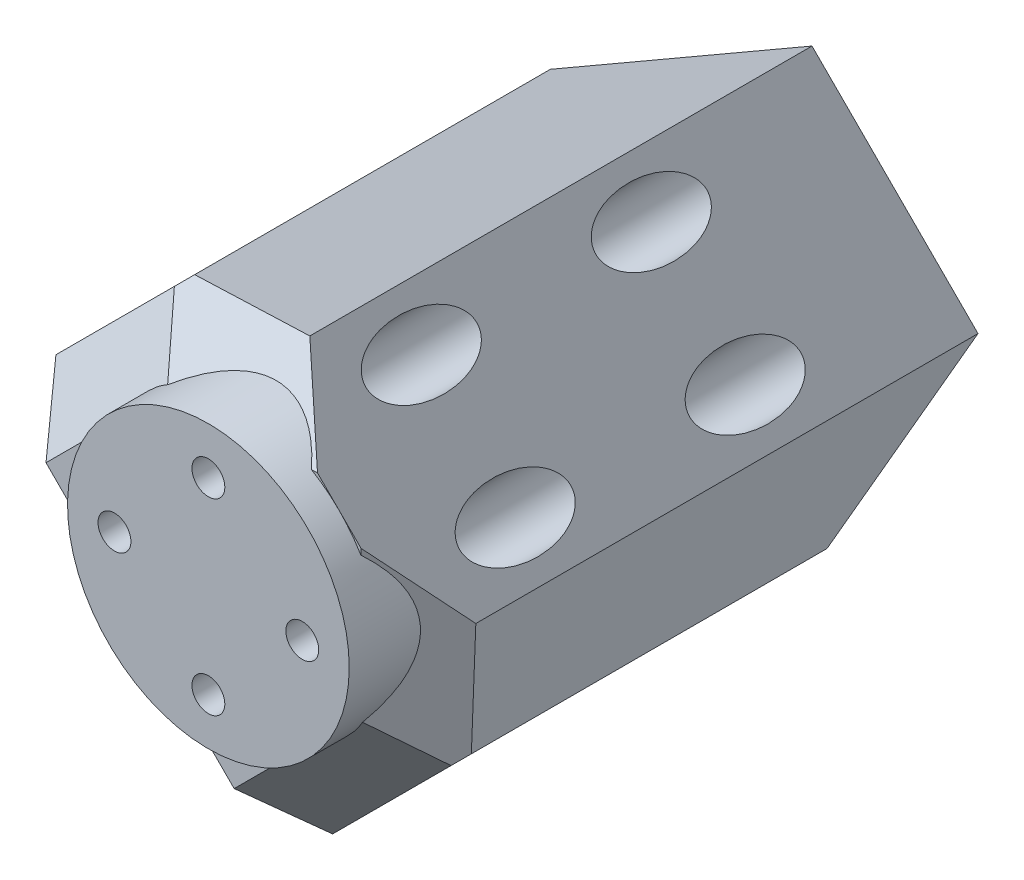
ISO-10303-21;
HEADER;
FILE_DESCRIPTION(('STEP AP214'),'2;1');
FILE_NAME('part.step','',(''),(''),'','','');
FILE_SCHEMA(('AUTOMOTIVE_DESIGN { 1 0 10303 214 1 1 1 1 }'));
ENDSEC;
DATA;
#1=APPLICATION_CONTEXT('core data for automotive mechanical design processes');
#2=APPLICATION_PROTOCOL_DEFINITION('international standard','automotive_design',2000,#1);
#3=PRODUCT_CONTEXT('',#1,'mechanical');
#4=PRODUCT('Part','Part','',(#3));
#5=PRODUCT_RELATED_PRODUCT_CATEGORY('part','',(#4));
#6=PRODUCT_DEFINITION_FORMATION('','',#4);
#7=PRODUCT_DEFINITION_CONTEXT('part definition',#1,'design');
#8=PRODUCT_DEFINITION('design','',#6,#7);
#9=PRODUCT_DEFINITION_SHAPE('','',#8);
#10=(LENGTH_UNIT() NAMED_UNIT(*) SI_UNIT(.MILLI.,.METRE.));
#11=(NAMED_UNIT(*) PLANE_ANGLE_UNIT() SI_UNIT($,.RADIAN.));
#12=(NAMED_UNIT(*) SI_UNIT($,.STERADIAN.) SOLID_ANGLE_UNIT());
#13=UNCERTAINTY_MEASURE_WITH_UNIT(LENGTH_MEASURE(1.E-05),#10,'distance_accuracy_value','');
#14=(GEOMETRIC_REPRESENTATION_CONTEXT(3) GLOBAL_UNCERTAINTY_ASSIGNED_CONTEXT((#13)) GLOBAL_UNIT_ASSIGNED_CONTEXT((#10,
#11,#12)) REPRESENTATION_CONTEXT('',''));
#15=CARTESIAN_POINT('',(0.,0.,0.));
#16=DIRECTION('',(0.,0.,1.));
#17=DIRECTION('',(1.,0.,0.));
#18=AXIS2_PLACEMENT_3D('',#15,#16,#17);
#19=CARTESIAN_POINT('',(0.,6.,2.));
#20=DIRECTION('',(0.,0.,-1.));
#21=DIRECTION('',(-1.,0.,0.));
#22=AXIS2_PLACEMENT_3D('',#19,#20,#21);
#23=CYLINDRICAL_SURFACE('',#22,1.05);
#24=CARTESIAN_POINT('',(0.,6.,2.));
#25=DIRECTION('',(0.,0.,1.));
#26=DIRECTION('',(1.,0.,0.));
#27=AXIS2_PLACEMENT_3D('',#24,#25,#26);
#28=CIRCLE('',#27,1.05);
#29=CARTESIAN_POINT('',(1.05,6.,2.));
#30=VERTEX_POINT('',#29);
#31=EDGE_CURVE('E414',#30,#30,#28,.T.);
#32=ORIENTED_EDGE('',*,*,#31,.T.);
#33=EDGE_LOOP('',(#32));
#34=FACE_BOUND('',#33,.T.);
#35=CARTESIAN_POINT('',(0.,6.,0.));
#36=DIRECTION('',(0.,0.,-1.));
#37=DIRECTION('',(-1.,0.,0.));
#38=AXIS2_PLACEMENT_3D('',#35,#36,#37);
#39=CIRCLE('',#38,1.05);
#40=CARTESIAN_POINT('',(-1.05,6.,0.));
#41=VERTEX_POINT('',#40);
#42=EDGE_CURVE('E191',#41,#41,#39,.T.);
#43=ORIENTED_EDGE('',*,*,#42,.T.);
#44=EDGE_LOOP('',(#43));
#45=FACE_BOUND('',#44,.T.);
#46=ADVANCED_FACE('F55',(#34,#45),#23,.F.);
#47=CARTESIAN_POINT('',(-6.,0.,2.));
#48=DIRECTION('',(0.,0.,-1.));
#49=DIRECTION('',(-1.,0.,0.));
#50=AXIS2_PLACEMENT_3D('',#47,#48,#49);
#51=CYLINDRICAL_SURFACE('',#50,1.05);
#52=CARTESIAN_POINT('',(-6.,0.,2.));
#53=DIRECTION('',(0.,0.,1.));
#54=DIRECTION('',(1.,0.,0.));
#55=AXIS2_PLACEMENT_3D('',#52,#53,#54);
#56=CIRCLE('',#55,1.05);
#57=CARTESIAN_POINT('',(-4.95,0.,2.));
#58=VERTEX_POINT('',#57);
#59=EDGE_CURVE('E408',#58,#58,#56,.T.);
#60=ORIENTED_EDGE('',*,*,#59,.T.);
#61=EDGE_LOOP('',(#60));
#62=FACE_BOUND('',#61,.T.);
#63=CARTESIAN_POINT('',(-6.,0.,0.));
#64=DIRECTION('',(0.,0.,-1.));
#65=DIRECTION('',(-1.,0.,0.));
#66=AXIS2_PLACEMENT_3D('',#63,#64,#65);
#67=CIRCLE('',#66,1.05);
#68=CARTESIAN_POINT('',(-7.05,0.,0.));
#69=VERTEX_POINT('',#68);
#70=EDGE_CURVE('E456',#69,#69,#67,.T.);
#71=ORIENTED_EDGE('',*,*,#70,.T.);
#72=EDGE_LOOP('',(#71));
#73=FACE_BOUND('',#72,.T.);
#74=ADVANCED_FACE('F523',(#62,#73),#51,.F.);
#75=CARTESIAN_POINT('',(0.,-6.,2.));
#76=DIRECTION('',(0.,0.,-1.));
#77=DIRECTION('',(-1.,0.,0.));
#78=AXIS2_PLACEMENT_3D('',#75,#76,#77);
#79=CYLINDRICAL_SURFACE('',#78,1.05);
#80=CARTESIAN_POINT('',(0.,-6.,2.));
#81=DIRECTION('',(0.,0.,1.));
#82=DIRECTION('',(1.,0.,0.));
#83=AXIS2_PLACEMENT_3D('',#80,#81,#82);
#84=CIRCLE('',#83,1.05);
#85=CARTESIAN_POINT('',(1.05,-6.,2.));
#86=VERTEX_POINT('',#85);
#87=EDGE_CURVE('E403',#86,#86,#84,.T.);
#88=ORIENTED_EDGE('',*,*,#87,.T.);
#89=EDGE_LOOP('',(#88));
#90=FACE_BOUND('',#89,.T.);
#91=CARTESIAN_POINT('',(0.,-6.,0.));
#92=DIRECTION('',(0.,0.,-1.));
#93=DIRECTION('',(-1.,0.,0.));
#94=AXIS2_PLACEMENT_3D('',#91,#92,#93);
#95=CIRCLE('',#94,1.05);
#96=CARTESIAN_POINT('',(-1.05,-6.,0.));
#97=VERTEX_POINT('',#96);
#98=EDGE_CURVE('E452',#97,#97,#95,.T.);
#99=ORIENTED_EDGE('',*,*,#98,.T.);
#100=EDGE_LOOP('',(#99));
#101=FACE_BOUND('',#100,.T.);
#102=ADVANCED_FACE('F529',(#90,#101),#79,.F.);
#103=CARTESIAN_POINT('',(6.,0.,2.));
#104=DIRECTION('',(0.,0.,-1.));
#105=DIRECTION('',(-1.,0.,0.));
#106=AXIS2_PLACEMENT_3D('',#103,#104,#105);
#107=CYLINDRICAL_SURFACE('',#106,1.05);
#108=CARTESIAN_POINT('',(6.,0.,2.));
#109=DIRECTION('',(0.,0.,1.));
#110=DIRECTION('',(1.,0.,0.));
#111=AXIS2_PLACEMENT_3D('',#108,#109,#110);
#112=CIRCLE('',#111,1.05);
#113=CARTESIAN_POINT('',(7.05,0.,2.));
#114=VERTEX_POINT('',#113);
#115=EDGE_CURVE('E400',#114,#114,#112,.T.);
#116=ORIENTED_EDGE('',*,*,#115,.T.);
#117=EDGE_LOOP('',(#116));
#118=FACE_BOUND('',#117,.T.);
#119=CARTESIAN_POINT('',(6.,0.,0.));
#120=DIRECTION('',(0.,0.,-1.));
#121=DIRECTION('',(-1.,0.,0.));
#122=AXIS2_PLACEMENT_3D('',#119,#120,#121);
#123=CIRCLE('',#122,1.05);
#124=CARTESIAN_POINT('',(4.95,0.,0.));
#125=VERTEX_POINT('',#124);
#126=EDGE_CURVE('E448',#125,#125,#123,.T.);
#127=ORIENTED_EDGE('',*,*,#126,.T.);
#128=EDGE_LOOP('',(#127));
#129=FACE_BOUND('',#128,.T.);
#130=ADVANCED_FACE('F520',(#118,#129),#107,.F.);
#131=CARTESIAN_POINT('',(0.,0.,0.));
#132=DIRECTION('',(0.,0.,-1.));
#133=DIRECTION('',(-1.,0.,0.));
#134=AXIS2_PLACEMENT_3D('',#131,#132,#133);
#135=PLANE('',#134);
#136=DIRECTION('',(-0.707106781186546,0.707106781186549,0.));
#137=VECTOR('',#136,1.);
#138=CARTESIAN_POINT('',(15.2027957955108,-2.47487373415295,0.));
#139=LINE('',#138,#137);
#140=CARTESIAN_POINT('',(6.36396103067894,6.36396103067891,0.));
#141=VERTEX_POINT('',#140);
#142=CARTESIAN_POINT('',(4.97165205518751,7.75627000617035,0.));
#143=VERTEX_POINT('',#142);
#144=EDGE_CURVE('E323',#141,#143,#139,.T.);
#145=ORIENTED_EDGE('',*,*,#144,.T.);
#146=DIRECTION('',(-0.999247156877888,-0.0387958692576702,0.));
#147=VECTOR('',#146,1.);
#148=CARTESIAN_POINT('',(-0.253175639005564,7.55341555647534,0.));
#149=LINE('',#148,#147);
#150=CARTESIAN_POINT('',(4.59018564589768,7.74145953526819,0.));
#151=VERTEX_POINT('',#150);
#152=EDGE_CURVE('E368',#143,#151,#149,.T.);
#153=ORIENTED_EDGE('',*,*,#152,.T.);
#154=CARTESIAN_POINT('',(0.,0.,0.));
#155=DIRECTION('',(0.,0.,1.));
#156=DIRECTION('',(1.,0.,0.));
#157=AXIS2_PLACEMENT_3D('',#154,#155,#156);
#158=CIRCLE('',#157,9.);
#159=EDGE_CURVE('E286',#141,#151,#158,.T.);
#160=ORIENTED_EDGE('',*,*,#159,.F.);
#161=EDGE_LOOP('',(#145,#153,#160));
#162=FACE_BOUND('',#161,.T.);
#163=ADVANCED_FACE('F239',(#162),#135,.F.);
#164=DIRECTION('',(-0.707106781186546,0.707106781186549,0.));
#165=VECTOR('',#164,1.);
#166=CARTESIAN_POINT('',(2.47487373415289,-15.2027957955108,0.));
#167=LINE('',#166,#165);
#168=CARTESIAN_POINT('',(-0.353553390593316,-12.3743686707646,0.));
#169=VERTEX_POINT('',#168);
#170=CARTESIAN_POINT('',(-6.36396103067894,-6.36396103067892,0.));
#171=VERTEX_POINT('',#170);
#172=EDGE_CURVE('E265',#169,#171,#167,.T.);
#173=ORIENTED_EDGE('',*,*,#172,.F.);
#174=DIRECTION('',(0.707106781186549,0.707106781186546,0.));
#175=VECTOR('',#174,1.);
#176=CARTESIAN_POINT('',(12.3743686707646,0.353553390593268,0.));
#177=LINE('',#176,#175);
#178=CARTESIAN_POINT('',(3.91875757375038,-8.10205770642088,0.));
#179=VERTEX_POINT('',#178);
#180=EDGE_CURVE('E274',#169,#179,#177,.T.);
#181=ORIENTED_EDGE('',*,*,#180,.T.);
#182=EDGE_CURVE('E287',#171,#179,#158,.T.);
#183=ORIENTED_EDGE('',*,*,#182,.F.);
#184=EDGE_LOOP('',(#173,#181,#183));
#185=FACE_BOUND('',#184,.T.);
#186=ADVANCED_FACE('F513',(#185),#135,.F.);
#187=CARTESIAN_POINT('',(0.,0.,2.));
#188=DIRECTION('',(0.,0.,-1.));
#189=DIRECTION('',(-1.,0.,0.));
#190=AXIS2_PLACEMENT_3D('',#187,#188,#189);
#191=CYLINDRICAL_SURFACE('',#190,9.);
#192=CARTESIAN_POINT('',(0.,0.,2.));
#193=DIRECTION('',(0.,0.,1.));
#194=DIRECTION('',(1.,0.,0.));
#195=AXIS2_PLACEMENT_3D('',#192,#193,#194);
#196=CIRCLE('',#195,9.);
#197=CARTESIAN_POINT('',(9.,0.,2.));
#198=VERTEX_POINT('',#197);
#199=EDGE_CURVE('E417',#198,#198,#196,.T.);
#200=ORIENTED_EDGE('',*,*,#199,.F.);
#201=EDGE_LOOP('',(#200));
#202=FACE_BOUND('',#201,.T.);
#203=ORIENTED_EDGE('',*,*,#159,.T.);
#204=CARTESIAN_POINT('',(0.,0.,13.3904937324361));
#205=DIRECTION('',(0.0337861125026571,-0.870213182646032,-0.491515529104648));
#206=DIRECTION('',(-0.0190687722052585,0.49114549501915,-0.870868810240083));
#207=AXIS2_PLACEMENT_3D('',#204,#205,#206);
#208=ELLIPSE('',#207,18.3107134303458,9.);
#209=CARTESIAN_POINT('',(-4.90677790253837,7.54476842687442,-0.304572845786324));
#210=VERTEX_POINT('',#209);
#211=EDGE_CURVE('E318',#151,#210,#208,.F.);
#212=ORIENTED_EDGE('',*,*,#211,.T.);
#213=CARTESIAN_POINT('',(0.,0.,8.49999999999984));
#214=DIRECTION('',(0.499999999999997,-0.499999999999999,-0.707106781186551));
#215=DIRECTION('',(-0.500000000000001,0.500000000000003,-0.707106781186544));
#216=AXIS2_PLACEMENT_3D('',#213,#214,#215);
#217=ELLIPSE('',#216,12.7279220613578,9.);
#218=CARTESIAN_POINT('',(-8.10205770642093,3.91875757375028,0.));
#219=VERTEX_POINT('',#218);
#220=EDGE_CURVE('E344',#210,#219,#217,.F.);
#221=ORIENTED_EDGE('',*,*,#220,.T.);
#222=EDGE_CURVE('E282',#219,#171,#158,.T.);
#223=ORIENTED_EDGE('',*,*,#222,.T.);
#224=ORIENTED_EDGE('',*,*,#182,.T.);
#225=CARTESIAN_POINT('',(0.,0.,8.50000000000006));
#226=DIRECTION('',(0.500000000000002,-0.500000000000003,0.707106781186544));
#227=DIRECTION('',(0.499999999999997,-0.499999999999998,-0.707106781186551));
#228=AXIS2_PLACEMENT_3D('',#225,#226,#227);
#229=ELLIPSE('',#228,12.7279220613579,9.);
#230=CARTESIAN_POINT('',(7.54476842687439,-4.90677790253843,-0.304572845786288));
#231=VERTEX_POINT('',#230);
#232=EDGE_CURVE('E393',#179,#231,#229,.T.);
#233=ORIENTED_EDGE('',*,*,#232,.T.);
#234=CARTESIAN_POINT('',(0.,0.,13.3904937324361));
#235=DIRECTION('',(0.870213182646032,-0.0337861125026576,0.491515529104648));
#236=DIRECTION('',(0.491145495019151,-0.0190687722052588,-0.870868810240083));
#237=AXIS2_PLACEMENT_3D('',#234,#235,#236);
#238=ELLIPSE('',#237,18.3107134303458,9.);
#239=CARTESIAN_POINT('',(7.74145953526819,4.5901856458977,0.));
#240=VERTEX_POINT('',#239);
#241=EDGE_CURVE('E67',#231,#240,#238,.T.);
#242=ORIENTED_EDGE('',*,*,#241,.T.);
#243=EDGE_CURVE('E298',#240,#141,#158,.T.);
#244=ORIENTED_EDGE('',*,*,#243,.T.);
#245=EDGE_LOOP('',(#203,#212,#221,#223,#224,#233,#242,#244));
#246=FACE_BOUND('',#245,.T.);
#247=ADVANCED_FACE('F391',(#202,#246),#191,.T.);
#248=CARTESIAN_POINT('',(0.,0.,2.));
#249=DIRECTION('',(0.,0.,1.));
#250=DIRECTION('',(1.,0.,0.));
#251=AXIS2_PLACEMENT_3D('',#248,#249,#250);
#252=PLANE('',#251);
#253=ORIENTED_EDGE('',*,*,#115,.F.);
#254=EDGE_LOOP('',(#253));
#255=FACE_BOUND('',#254,.T.);
#256=ORIENTED_EDGE('',*,*,#87,.F.);
#257=EDGE_LOOP('',(#256));
#258=FACE_BOUND('',#257,.T.);
#259=ORIENTED_EDGE('',*,*,#59,.F.);
#260=EDGE_LOOP('',(#259));
#261=FACE_BOUND('',#260,.T.);
#262=ORIENTED_EDGE('',*,*,#31,.F.);
#263=EDGE_LOOP('',(#262));
#264=FACE_BOUND('',#263,.T.);
#265=ORIENTED_EDGE('',*,*,#199,.T.);
#266=EDGE_LOOP('',(#265));
#267=FACE_BOUND('',#266,.T.);
#268=ADVANCED_FACE('F233',(#255,#258,#261,#264,#267),#252,.T.);
#269=CARTESIAN_POINT('',(-6.14222664866223,-6.14222664866221,1.65041984364444));
#270=DIRECTION('',(-0.694678991801553,-0.69467899180155,0.186660645823271));
#271=DIRECTION('',(0.707106781186546,-0.707106781186549,0.));
#272=AXIS2_PLACEMENT_3D('',#269,#270,#271);
#273=PLANE('',#272);
#274=DIRECTION('',(-0.707106781186546,0.707106781186549,0.));
#275=VECTOR('',#274,1.);
#276=CARTESIAN_POINT('',(-8.1317279836453,-8.13172798364525,-13.1578947368419));
#277=LINE('',#276,#275);
#278=CARTESIAN_POINT('',(0.70710678118654,-16.9705627484771,-13.1578947368419));
#279=VERTEX_POINT('',#278);
#280=CARTESIAN_POINT('',(-16.9705627484771,0.707106781186595,-13.157894736842));
#281=VERTEX_POINT('',#280);
#282=EDGE_CURVE('E155',#279,#281,#277,.T.);
#283=ORIENTED_EDGE('',*,*,#282,.F.);
#284=DIRECTION('',(0.131989008442295,0.131989008442295,0.982424451701422));
#285=VECTOR('',#284,1.);
#286=CARTESIAN_POINT('',(-4.24264068711933,-21.920310216783,-50.));
#287=LINE('',#286,#285);
#288=CARTESIAN_POINT('',(1.9374725804511,-15.7401969492126,-4.00000000000008));
#289=VERTEX_POINT('',#288);
#290=EDGE_CURVE('E184',#279,#289,#287,.T.);
#291=ORIENTED_EDGE('',*,*,#290,.T.);
#292=DIRECTION('',(-0.401393623541272,0.589701743227307,0.700810254644638));
#293=VECTOR('',#292,1.);
#294=CARTESIAN_POINT('',(-3.22563422704082,-8.15489188635399,5.01448848288394));
#295=LINE('',#294,#293);
#296=EDGE_CURVE('E270',#289,#169,#295,.T.);
#297=ORIENTED_EDGE('',*,*,#296,.T.);
#298=ORIENTED_EDGE('',*,*,#172,.T.);
#299=CARTESIAN_POINT('',(-12.3743686707645,-0.353553390593302,0.));
#300=VERTEX_POINT('',#299);
#301=EDGE_CURVE('E188',#171,#300,#167,.T.);
#302=ORIENTED_EDGE('',*,*,#301,.T.);
#303=DIRECTION('',(0.589701743227309,-0.401393623541281,0.700810254644631));
#304=VECTOR('',#303,1.);
#305=CARTESIAN_POINT('',(-8.15489188635393,-3.22563422704088,5.0144884828839));
#306=LINE('',#305,#304);
#307=CARTESIAN_POINT('',(-15.7401969492125,1.93747258045116,-4.00000000000004));
#308=VERTEX_POINT('',#307);
#309=EDGE_CURVE('E181',#300,#308,#306,.F.);
#310=ORIENTED_EDGE('',*,*,#309,.T.);
#311=DIRECTION('',(0.131989008442294,0.131989008442294,0.982424451701422));
#312=VECTOR('',#311,1.);
#313=CARTESIAN_POINT('',(-21.920310216783,-4.24264068711924,-50.));
#314=LINE('',#313,#312);
#315=EDGE_CURVE('E172',#281,#308,#314,.T.);
#316=ORIENTED_EDGE('',*,*,#315,.F.);
#317=EDGE_LOOP('',(#283,#291,#297,#298,#302,#310,#316));
#318=FACE_BOUND('',#317,.T.);
#319=ADVANCED_FACE('F178',(#318),#273,.T.);
#320=CARTESIAN_POINT('',(-8.83883476483182,8.83883476483186,0.));
#321=DIRECTION('',(0.707106781186546,-0.707106781186549,0.));
#322=DIRECTION('',(0.707106781186549,0.707106781186546,0.));
#323=AXIS2_PLACEMENT_3D('',#320,#321,#322);
#324=PLANE('',#323);
#325=DIRECTION('',(-0.268243277556239,-0.268243277556239,-0.9252519052084));
#326=VECTOR('',#325,1.);
#327=CARTESIAN_POINT('',(-6.66196392389743,11.0157056057662,-1.26220970938142));
#328=LINE('',#327,#326);
#329=CARTESIAN_POINT('',(-7.69247588336472,9.98519364629896,-4.81675602466509));
#330=VERTEX_POINT('',#329);
#331=CARTESIAN_POINT('',(-16.9705627484771,0.707106781186591,-36.819673774708));
#332=VERTEX_POINT('',#331);
#333=EDGE_CURVE('E175',#330,#332,#328,.T.);
#334=ORIENTED_EDGE('',*,*,#333,.T.);
#335=DIRECTION('',(0.,0.,-1.));
#336=VECTOR('',#335,1.);
#337=CARTESIAN_POINT('',(-16.9705627484771,0.707106781186573,-50.));
#338=LINE('',#337,#336);
#339=EDGE_CURVE('E158',#281,#332,#338,.T.);
#340=ORIENTED_EDGE('',*,*,#339,.F.);
#341=ORIENTED_EDGE('',*,*,#315,.T.);
#342=DIRECTION('',(0.707106781186549,0.707106781186546,0.));
#343=VECTOR('',#342,1.);
#344=CARTESIAN_POINT('',(-8.83883476483182,8.83883476483186,-4.00000000000003));
#345=LINE('',#344,#343);
#346=CARTESIAN_POINT('',(-8.17243197749716,9.50523755216652,-4.00000000000003));
#347=VERTEX_POINT('',#346);
#348=EDGE_CURVE('E507',#308,#347,#345,.T.);
#349=ORIENTED_EDGE('',*,*,#348,.T.);
#350=DIRECTION('',(-0.451943650425837,-0.451943650425834,0.769086388957405));
#351=VECTOR('',#350,1.);
#352=CARTESIAN_POINT('',(-8.35239294667875,9.32527658298493,-3.69375489220676));
#353=LINE('',#352,#351);
#354=EDGE_CURVE('E363',#347,#330,#353,.F.);
#355=ORIENTED_EDGE('',*,*,#354,.T.);
#356=EDGE_LOOP('',(#334,#340,#341,#349,#355));
#357=FACE_BOUND('',#356,.T.);
#358=ADVANCED_FACE('F170',(#357),#324,.F.);
#359=CARTESIAN_POINT('',(8.83883476483183,-8.83883476483186,0.));
#360=DIRECTION('',(0.707106781186546,-0.707106781186549,0.));
#361=DIRECTION('',(0.707106781186549,0.707106781186546,0.));
#362=AXIS2_PLACEMENT_3D('',#359,#360,#361);
#363=PLANE('',#362);
#364=DIRECTION('',(0.,0.,1.));
#365=VECTOR('',#364,1.);
#366=CARTESIAN_POINT('',(0.707106781186538,-16.9705627484771,0.));
#367=LINE('',#366,#365);
#368=CARTESIAN_POINT('',(0.707106781186542,-16.9705627484771,-36.8196737747081));
#369=VERTEX_POINT('',#368);
#370=EDGE_CURVE('E161',#369,#279,#367,.T.);
#371=ORIENTED_EDGE('',*,*,#370,.F.);
#372=DIRECTION('',(0.268243277556239,0.268243277556239,0.9252519052084));
#373=VECTOR('',#372,1.);
#374=CARTESIAN_POINT('',(10.7718811919716,-6.90578833769207,-2.10323359432286));
#375=LINE('',#374,#373);
#376=CARTESIAN_POINT('',(9.98519364629894,-7.69247588336476,-4.81675602466509));
#377=VERTEX_POINT('',#376);
#378=EDGE_CURVE('E326',#369,#377,#375,.T.);
#379=ORIENTED_EDGE('',*,*,#378,.T.);
#380=DIRECTION('',(-0.451943650425836,-0.451943650425833,0.769086388957406));
#381=VECTOR('',#380,1.);
#382=CARTESIAN_POINT('',(7.84267309047031,-9.83499643919338,-1.17076299877201));
#383=LINE('',#382,#381);
#384=CARTESIAN_POINT('',(9.50523755216652,-8.17243197749717,-4.00000000000007));
#385=VERTEX_POINT('',#384);
#386=EDGE_CURVE('E83',#377,#385,#383,.T.);
#387=ORIENTED_EDGE('',*,*,#386,.T.);
#388=DIRECTION('',(-0.707106781186549,-0.707106781186546,0.));
#389=VECTOR('',#388,1.);
#390=CARTESIAN_POINT('',(2.47487373415289,-15.2027957955108,-4.00000000000007));
#391=LINE('',#390,#389);
#392=EDGE_CURVE('E271',#385,#289,#391,.T.);
#393=ORIENTED_EDGE('',*,*,#392,.T.);
#394=ORIENTED_EDGE('',*,*,#290,.F.);
#395=EDGE_LOOP('',(#371,#379,#387,#393,#394));
#396=FACE_BOUND('',#395,.T.);
#397=ADVANCED_FACE('F222',(#396),#363,.T.);
#398=CARTESIAN_POINT('',(5.44813032332758,5.44813032332756,-3.15897611505864));
#399=DIRECTION('',(-0.654251896478633,-0.654251896478631,0.379353281135443));
#400=DIRECTION('',(0.707106781186546,-0.707106781186549,0.));
#401=AXIS2_PLACEMENT_3D('',#398,#399,#400);
#402=PLANE('',#401);
#403=CARTESIAN_POINT('',(0.,-6.,-32.2991236271202));
#404=DIRECTION('',(-0.654251896478633,-0.654251896478631,0.379353281135443));
#405=DIRECTION('',(0.268243277556239,0.268243277556238,0.9252519052084));
#406=AXIS2_PLACEMENT_3D('',#403,#404,#405);
#407=ELLIPSE('',#406,5.40393375236966,2.05);
#408=CARTESIAN_POINT('',(1.44956890143242,-4.55043109856758,-27.2991236271202));
#409=VERTEX_POINT('',#408);
#410=EDGE_CURVE('E444',#409,#409,#407,.F.);
#411=ORIENTED_EDGE('',*,*,#410,.F.);
#412=EDGE_LOOP('',(#411));
#413=FACE_BOUND('',#412,.T.);
#414=CARTESIAN_POINT('',(0.,6.,-11.6033153972701));
#415=DIRECTION('',(-0.654251896478633,-0.654251896478631,0.379353281135443));
#416=DIRECTION('',(0.268243277556239,0.268243277556238,0.9252519052084));
#417=AXIS2_PLACEMENT_3D('',#414,#415,#416);
#418=ELLIPSE('',#417,5.40393375236966,2.05);
#419=CARTESIAN_POINT('',(1.44956890143242,7.44956890143242,-6.60331539727006));
#420=VERTEX_POINT('',#419);
#421=EDGE_CURVE('E440',#420,#420,#418,.F.);
#422=ORIENTED_EDGE('',*,*,#421,.F.);
#423=EDGE_LOOP('',(#422));
#424=FACE_BOUND('',#423,.T.);
#425=CARTESIAN_POINT('',(6.,0.,-11.60331539727));
#426=DIRECTION('',(-0.654251896478633,-0.654251896478631,0.379353281135443));
#427=DIRECTION('',(0.268243277556239,0.268243277556238,0.9252519052084));
#428=AXIS2_PLACEMENT_3D('',#425,#426,#427);
#429=ELLIPSE('',#428,5.40393375236966,2.05);
#430=CARTESIAN_POINT('',(7.44956890143243,1.44956890143242,-6.60331539727002));
#431=VERTEX_POINT('',#430);
#432=EDGE_CURVE('E435',#431,#431,#429,.F.);
#433=ORIENTED_EDGE('',*,*,#432,.F.);
#434=EDGE_LOOP('',(#433));
#435=FACE_BOUND('',#434,.T.);
#436=CARTESIAN_POINT('',(-6.,0.,-32.2991236271203));
#437=DIRECTION('',(-0.654251896478633,-0.654251896478631,0.379353281135443));
#438=DIRECTION('',(0.268243277556239,0.268243277556238,0.9252519052084));
#439=AXIS2_PLACEMENT_3D('',#436,#437,#438);
#440=ELLIPSE('',#439,5.40393375236966,2.05);
#441=CARTESIAN_POINT('',(-4.55043109856758,1.44956890143242,-27.2991236271203));
#442=VERTEX_POINT('',#441);
#443=EDGE_CURVE('E431',#442,#442,#440,.F.);
#444=ORIENTED_EDGE('',*,*,#443,.F.);
#445=EDGE_LOOP('',(#444));
#446=FACE_BOUND('',#445,.T.);
#447=DIRECTION('',(0.268243277556239,0.268243277556239,0.9252519052084));
#448=VECTOR('',#447,1.);
#449=CARTESIAN_POINT('',(0.144829464428489,10.7514311822267,-3.15897611505864));
#450=LINE('',#449,#448);
#451=CARTESIAN_POINT('',(-13.4350288425444,-2.82842712474616,-50.));
#452=VERTEX_POINT('',#451);
#453=CARTESIAN_POINT('',(-0.335783776048503,10.2708179417497,-4.81675602466509));
#454=VERTEX_POINT('',#453);
#455=EDGE_CURVE('E343',#452,#454,#450,.T.);
#456=ORIENTED_EDGE('',*,*,#455,.T.);
#457=DIRECTION('',(-0.698752415898631,0.331053733054702,-0.634151785542209));
#458=VECTOR('',#457,1.);
#459=CARTESIAN_POINT('',(2.44834588069542,8.95175772070123,-2.2900230176177));
#460=LINE('',#459,#458);
#461=EDGE_CURVE('E310',#454,#143,#460,.F.);
#462=ORIENTED_EDGE('',*,*,#461,.T.);
#463=ORIENTED_EDGE('',*,*,#144,.F.);
#464=CARTESIAN_POINT('',(7.75627000617034,4.97165205518751,0.));
#465=VERTEX_POINT('',#464);
#466=EDGE_CURVE('E302',#465,#141,#139,.T.);
#467=ORIENTED_EDGE('',*,*,#466,.F.);
#468=DIRECTION('',(0.331053733054701,-0.698752415898633,-0.634151785542208));
#469=VECTOR('',#468,1.);
#470=CARTESIAN_POINT('',(8.95175772070122,2.44834588069541,-2.2900230176177));
#471=LINE('',#470,#469);
#472=CARTESIAN_POINT('',(10.2708179417497,-0.335783776048534,-4.81675602466509));
#473=VERTEX_POINT('',#472);
#474=EDGE_CURVE('E345',#465,#473,#471,.T.);
#475=ORIENTED_EDGE('',*,*,#474,.T.);
#476=DIRECTION('',(-0.268243277556239,-0.268243277556239,-0.9252519052084));
#477=VECTOR('',#476,1.);
#478=CARTESIAN_POINT('',(-2.8284271247462,-13.4350288425444,-50.));
#479=LINE('',#478,#477);
#480=CARTESIAN_POINT('',(-2.8284271247462,-13.4350288425444,-50.));
#481=VERTEX_POINT('',#480);
#482=EDGE_CURVE('E338',#473,#481,#479,.T.);
#483=ORIENTED_EDGE('',*,*,#482,.T.);
#484=DIRECTION('',(-0.707106781186545,0.70710678118655,0.));
#485=VECTOR('',#484,1.);
#486=CARTESIAN_POINT('',(0.707106781186526,-16.9705627484772,-50.));
#487=LINE('',#486,#485);
#488=EDGE_CURVE('E60',#481,#452,#487,.T.);
#489=ORIENTED_EDGE('',*,*,#488,.T.);
#490=EDGE_LOOP('',(#456,#462,#463,#467,#475,#483,#489));
#491=FACE_BOUND('',#490,.T.);
#492=ADVANCED_FACE('F211',(#413,#424,#435,#446,#491),#402,.F.);
#493=ORIENTED_EDGE('',*,*,#243,.F.);
#494=DIRECTION('',(0.0387958692576708,0.999247156877888,0.));
#495=VECTOR('',#494,1.);
#496=CARTESIAN_POINT('',(7.61054041556547,1.21816278245756,0.));
#497=LINE('',#496,#495);
#498=EDGE_CURVE('E305',#240,#465,#497,.T.);
#499=ORIENTED_EDGE('',*,*,#498,.T.);
#500=ORIENTED_EDGE('',*,*,#466,.T.);
#501=EDGE_LOOP('',(#493,#499,#500));
#502=FACE_BOUND('',#501,.T.);
#503=ADVANCED_FACE('F221',(#502),#135,.F.);
#504=ORIENTED_EDGE('',*,*,#222,.F.);
#505=DIRECTION('',(-0.707106781186549,-0.707106781186546,0.));
#506=VECTOR('',#505,1.);
#507=CARTESIAN_POINT('',(-6.01040764008559,6.01040764008562,0.));
#508=LINE('',#507,#506);
#509=EDGE_CURVE('E279',#219,#300,#508,.T.);
#510=ORIENTED_EDGE('',*,*,#509,.T.);
#511=ORIENTED_EDGE('',*,*,#301,.F.);
#512=EDGE_LOOP('',(#504,#510,#511));
#513=FACE_BOUND('',#512,.T.);
#514=ADVANCED_FACE('F237',(#513),#135,.F.);
#515=CARTESIAN_POINT('',(8.83883476483183,-8.83883476483186,-4.00000000000007));
#516=DIRECTION('',(0.500000000000002,-0.500000000000003,0.707106781186544));
#517=DIRECTION('',(0.707106781186549,0.707106781186546,0.));
#518=AXIS2_PLACEMENT_3D('',#515,#516,#517);
#519=PLANE('',#518);
#520=ORIENTED_EDGE('',*,*,#392,.F.);
#521=DIRECTION('',(-0.369412794282357,0.615349857555298,0.69633234897366));
#522=VECTOR('',#521,1.);
#523=CARTESIAN_POINT('',(9.56578177663039,-8.27328360060353,-4.11412409827233));
#524=LINE('',#523,#522);
#525=EDGE_CURVE('E75',#385,#231,#524,.T.);
#526=ORIENTED_EDGE('',*,*,#525,.T.);
#527=ORIENTED_EDGE('',*,*,#232,.F.);
#528=ORIENTED_EDGE('',*,*,#180,.F.);
#529=ORIENTED_EDGE('',*,*,#296,.F.);
#530=EDGE_LOOP('',(#520,#526,#527,#528,#529));
#531=FACE_BOUND('',#530,.T.);
#532=ADVANCED_FACE('F512',(#531),#519,.T.);
#533=CARTESIAN_POINT('',(-6.01040764008559,6.01040764008561,0.));
#534=DIRECTION('',(0.499999999999997,-0.499999999999999,-0.707106781186551));
#535=DIRECTION('',(-0.707106781186549,-0.707106781186546,0.));
#536=AXIS2_PLACEMENT_3D('',#533,#534,#535);
#537=PLANE('',#536);
#538=ORIENTED_EDGE('',*,*,#220,.F.);
#539=DIRECTION('',(-0.615349857555311,0.369412794282352,-0.696332348973651));
#540=VECTOR('',#539,1.);
#541=CARTESIAN_POINT('',(-4.84537950658674,7.50790914636194,-0.235094176454918));
#542=LINE('',#541,#540);
#543=EDGE_CURVE('E361',#210,#347,#542,.T.);
#544=ORIENTED_EDGE('',*,*,#543,.T.);
#545=ORIENTED_EDGE('',*,*,#348,.F.);
#546=ORIENTED_EDGE('',*,*,#309,.F.);
#547=ORIENTED_EDGE('',*,*,#509,.F.);
#548=EDGE_LOOP('',(#538,#544,#545,#546,#547));
#549=FACE_BOUND('',#548,.T.);
#550=ADVANCED_FACE('F504',(#549),#537,.F.);
#551=CARTESIAN_POINT('',(-6.,0.,-53.));
#552=DIRECTION('',(0.,0.,1.));
#553=DIRECTION('',(1.,0.,0.));
#554=AXIS2_PLACEMENT_3D('',#551,#552,#553);
#555=CYLINDRICAL_SURFACE('',#554,2.05);
#556=CARTESIAN_POINT('',(-6.,0.,0.));
#557=DIRECTION('',(0.,0.,-1.));
#558=DIRECTION('',(-1.,0.,0.));
#559=AXIS2_PLACEMENT_3D('',#556,#557,#558);
#560=CIRCLE('',#559,2.05);
#561=CARTESIAN_POINT('',(-8.05,0.,0.));
#562=VERTEX_POINT('',#561);
#563=EDGE_CURVE('E482',#562,#562,#560,.T.);
#564=ORIENTED_EDGE('',*,*,#563,.F.);
#565=EDGE_LOOP('',(#564));
#566=FACE_BOUND('',#565,.T.);
#567=ORIENTED_EDGE('',*,*,#443,.T.);
#568=EDGE_LOOP('',(#567));
#569=FACE_BOUND('',#568,.T.);
#570=ADVANCED_FACE('F549',(#566,#569),#555,.F.);
#571=CARTESIAN_POINT('',(-6.,0.,0.));
#572=DIRECTION('',(0.,0.,-1.));
#573=DIRECTION('',(-1.,0.,0.));
#574=AXIS2_PLACEMENT_3D('',#571,#572,#573);
#575=PLANE('',#574);
#576=ORIENTED_EDGE('',*,*,#70,.F.);
#577=EDGE_LOOP('',(#576));
#578=FACE_BOUND('',#577,.T.);
#579=ORIENTED_EDGE('',*,*,#563,.T.);
#580=EDGE_LOOP('',(#579));
#581=FACE_BOUND('',#580,.T.);
#582=ADVANCED_FACE('F224',(#578,#581),#575,.T.);
#583=CARTESIAN_POINT('',(6.,0.,-53.));
#584=DIRECTION('',(0.,0.,1.));
#585=DIRECTION('',(1.,0.,0.));
#586=AXIS2_PLACEMENT_3D('',#583,#584,#585);
#587=CYLINDRICAL_SURFACE('',#586,2.05);
#588=CARTESIAN_POINT('',(6.,0.,0.));
#589=DIRECTION('',(0.,0.,-1.));
#590=DIRECTION('',(-1.,0.,0.));
#591=AXIS2_PLACEMENT_3D('',#588,#589,#590);
#592=CIRCLE('',#591,2.05);
#593=CARTESIAN_POINT('',(3.95,0.,0.));
#594=VERTEX_POINT('',#593);
#595=EDGE_CURVE('E475',#594,#594,#592,.T.);
#596=ORIENTED_EDGE('',*,*,#595,.F.);
#597=EDGE_LOOP('',(#596));
#598=FACE_BOUND('',#597,.T.);
#599=ORIENTED_EDGE('',*,*,#432,.T.);
#600=EDGE_LOOP('',(#599));
#601=FACE_BOUND('',#600,.T.);
#602=ADVANCED_FACE('F590',(#598,#601),#587,.F.);
#603=CARTESIAN_POINT('',(6.,0.,0.));
#604=DIRECTION('',(0.,0.,-1.));
#605=DIRECTION('',(-1.,0.,0.));
#606=AXIS2_PLACEMENT_3D('',#603,#604,#605);
#607=PLANE('',#606);
#608=ORIENTED_EDGE('',*,*,#126,.F.);
#609=EDGE_LOOP('',(#608));
#610=FACE_BOUND('',#609,.T.);
#611=ORIENTED_EDGE('',*,*,#595,.T.);
#612=EDGE_LOOP('',(#611));
#613=FACE_BOUND('',#612,.T.);
#614=ADVANCED_FACE('F588',(#610,#613),#607,.T.);
#615=CARTESIAN_POINT('',(0.,6.,-53.));
#616=DIRECTION('',(0.,0.,1.));
#617=DIRECTION('',(1.,0.,0.));
#618=AXIS2_PLACEMENT_3D('',#615,#616,#617);
#619=CYLINDRICAL_SURFACE('',#618,2.05);
#620=CARTESIAN_POINT('',(0.,6.,0.));
#621=DIRECTION('',(0.,0.,-1.));
#622=DIRECTION('',(-1.,0.,0.));
#623=AXIS2_PLACEMENT_3D('',#620,#621,#622);
#624=CIRCLE('',#623,2.05);
#625=CARTESIAN_POINT('',(-2.05,6.,0.));
#626=VERTEX_POINT('',#625);
#627=EDGE_CURVE('E472',#626,#626,#624,.T.);
#628=ORIENTED_EDGE('',*,*,#627,.F.);
#629=EDGE_LOOP('',(#628));
#630=FACE_BOUND('',#629,.T.);
#631=ORIENTED_EDGE('',*,*,#421,.T.);
#632=EDGE_LOOP('',(#631));
#633=FACE_BOUND('',#632,.T.);
#634=ADVANCED_FACE('F468',(#630,#633),#619,.F.);
#635=CARTESIAN_POINT('',(0.,6.,0.));
#636=DIRECTION('',(0.,0.,-1.));
#637=DIRECTION('',(-1.,0.,0.));
#638=AXIS2_PLACEMENT_3D('',#635,#636,#637);
#639=PLANE('',#638);
#640=ORIENTED_EDGE('',*,*,#42,.F.);
#641=EDGE_LOOP('',(#640));
#642=FACE_BOUND('',#641,.T.);
#643=ORIENTED_EDGE('',*,*,#627,.T.);
#644=EDGE_LOOP('',(#643));
#645=FACE_BOUND('',#644,.T.);
#646=ADVANCED_FACE('F464',(#642,#645),#639,.T.);
#647=CARTESIAN_POINT('',(0.,-6.,-53.));
#648=DIRECTION('',(0.,0.,1.));
#649=DIRECTION('',(1.,0.,0.));
#650=AXIS2_PLACEMENT_3D('',#647,#648,#649);
#651=CYLINDRICAL_SURFACE('',#650,2.05);
#652=CARTESIAN_POINT('',(0.,-6.,0.));
#653=DIRECTION('',(0.,0.,-1.));
#654=DIRECTION('',(-1.,0.,0.));
#655=AXIS2_PLACEMENT_3D('',#652,#653,#654);
#656=CIRCLE('',#655,2.05);
#657=CARTESIAN_POINT('',(-2.05,-6.,0.));
#658=VERTEX_POINT('',#657);
#659=EDGE_CURVE('E436',#658,#658,#656,.T.);
#660=ORIENTED_EDGE('',*,*,#659,.F.);
#661=EDGE_LOOP('',(#660));
#662=FACE_BOUND('',#661,.T.);
#663=ORIENTED_EDGE('',*,*,#410,.T.);
#664=EDGE_LOOP('',(#663));
#665=FACE_BOUND('',#664,.T.);
#666=ADVANCED_FACE('F467',(#662,#665),#651,.F.);
#667=CARTESIAN_POINT('',(0.,-6.,0.));
#668=DIRECTION('',(0.,0.,-1.));
#669=DIRECTION('',(-1.,0.,0.));
#670=AXIS2_PLACEMENT_3D('',#667,#668,#669);
#671=PLANE('',#670);
#672=ORIENTED_EDGE('',*,*,#98,.F.);
#673=EDGE_LOOP('',(#672));
#674=FACE_BOUND('',#673,.T.);
#675=ORIENTED_EDGE('',*,*,#659,.T.);
#676=EDGE_LOOP('',(#675));
#677=FACE_BOUND('',#676,.T.);
#678=ADVANCED_FACE('F555',(#674,#677),#671,.T.);
#679=CARTESIAN_POINT('',(0.144829464428489,10.7514311822267,-3.15897611505864));
#680=DIRECTION('',(0.0373740473958002,-0.9626259526042,0.268243277556239));
#681=DIRECTION('',(0.268243277556239,0.268243277556239,0.9252519052084));
#682=AXIS2_PLACEMENT_3D('',#679,#680,#681);
#683=PLANE('',#682);
#684=DIRECTION('',(-0.250803229924769,0.250803229924771,0.934984213619998));
#685=VECTOR('',#684,1.);
#686=CARTESIAN_POINT('',(-24.4191112639555,8.15565529666501,-9.05178865439299));
#687=LINE('',#686,#685);
#688=EDGE_CURVE('E166',#332,#452,#687,.F.);
#689=ORIENTED_EDGE('',*,*,#688,.F.);
#690=ORIENTED_EDGE('',*,*,#333,.F.);
#691=DIRECTION('',(-0.999247156877888,-0.0387958692576702,0.));
#692=VECTOR('',#691,1.);
#693=CARTESIAN_POINT('',(1.11269382740645,10.3270552273296,-4.81675602466509));
#694=LINE('',#693,#692);
#695=EDGE_CURVE('E336',#330,#454,#694,.F.);
#696=ORIENTED_EDGE('',*,*,#695,.T.);
#697=ORIENTED_EDGE('',*,*,#455,.F.);
#698=EDGE_LOOP('',(#689,#690,#696,#697));
#699=FACE_BOUND('',#698,.T.);
#700=ADVANCED_FACE('F496',(#699),#683,.F.);
#701=CARTESIAN_POINT('',(11.0157056057662,-6.66196392389747,-1.26220970938141));
#702=DIRECTION('',(0.9626259526042,-0.0373740473958008,-0.268243277556239));
#703=DIRECTION('',(-0.268243277556239,-0.268243277556239,-0.9252519052084));
#704=AXIS2_PLACEMENT_3D('',#701,#702,#703);
#705=PLANE('',#704);
#706=DIRECTION('',(0.25080322992477,-0.250803229924771,0.934984213619997));
#707=VECTOR('',#706,1.);
#708=CARTESIAN_POINT('',(9.04522759061392,-25.3086835579045,-5.73549941854277));
#709=LINE('',#708,#707);
#710=EDGE_CURVE('E12',#481,#369,#709,.T.);
#711=ORIENTED_EDGE('',*,*,#710,.F.);
#712=ORIENTED_EDGE('',*,*,#482,.F.);
#713=DIRECTION('',(-0.0387958692576708,-0.999247156877888,0.));
#714=VECTOR('',#713,1.);
#715=CARTESIAN_POINT('',(10.2699303682395,-0.358644594056816,-4.81675602466509));
#716=LINE('',#715,#714);
#717=EDGE_CURVE('E309',#473,#377,#716,.T.);
#718=ORIENTED_EDGE('',*,*,#717,.T.);
#719=ORIENTED_EDGE('',*,*,#378,.F.);
#720=EDGE_LOOP('',(#711,#712,#718,#719));
#721=FACE_BOUND('',#720,.T.);
#722=ADVANCED_FACE('F385',(#721),#705,.T.);
#723=CARTESIAN_POINT('',(-0.293201767817789,7.55186153808299,0.));
#724=DIRECTION('',(0.0337861125026571,-0.870213182646032,-0.491515529104648));
#725=DIRECTION('',(-0.999247156877888,-0.0387958692576702,0.));
#726=AXIS2_PLACEMENT_3D('',#723,#724,#725);
#727=PLANE('',#726);
#728=ORIENTED_EDGE('',*,*,#461,.F.);
#729=ORIENTED_EDGE('',*,*,#695,.F.);
#730=ORIENTED_EDGE('',*,*,#354,.F.);
#731=ORIENTED_EDGE('',*,*,#543,.F.);
#732=ORIENTED_EDGE('',*,*,#211,.F.);
#733=ORIENTED_EDGE('',*,*,#152,.F.);
#734=EDGE_LOOP('',(#728,#729,#730,#731,#732,#733));
#735=FACE_BOUND('',#734,.T.);
#736=ADVANCED_FACE('F499',(#735),#727,.F.);
#737=CARTESIAN_POINT('',(7.55186153808298,-0.293201767817793,0.));
#738=DIRECTION('',(0.870213182646032,-0.0337861125026576,0.491515529104648));
#739=DIRECTION('',(-0.0387958692576708,-0.999247156877888,0.));
#740=AXIS2_PLACEMENT_3D('',#737,#738,#739);
#741=PLANE('',#740);
#742=ORIENTED_EDGE('',*,*,#386,.F.);
#743=ORIENTED_EDGE('',*,*,#717,.F.);
#744=ORIENTED_EDGE('',*,*,#474,.F.);
#745=ORIENTED_EDGE('',*,*,#498,.F.);
#746=ORIENTED_EDGE('',*,*,#241,.F.);
#747=ORIENTED_EDGE('',*,*,#525,.F.);
#748=EDGE_LOOP('',(#742,#743,#744,#745,#746,#747));
#749=FACE_BOUND('',#748,.T.);
#750=ADVANCED_FACE('F58',(#749),#741,.T.);
#751=CARTESIAN_POINT('',(7.07106781186545,-23.3345237791561,-50.));
#752=DIRECTION('',(0.707106781186549,0.707106781186546,0.));
#753=DIRECTION('',(-0.707106781186546,0.707106781186549,0.));
#754=AXIS2_PLACEMENT_3D('',#751,#752,#753);
#755=PLANE('',#754);
#756=ORIENTED_EDGE('',*,*,#688,.T.);
#757=ORIENTED_EDGE('',*,*,#488,.F.);
#758=ORIENTED_EDGE('',*,*,#710,.T.);
#759=ORIENTED_EDGE('',*,*,#370,.T.);
#760=ORIENTED_EDGE('',*,*,#282,.T.);
#761=ORIENTED_EDGE('',*,*,#339,.T.);
#762=EDGE_LOOP('',(#756,#757,#758,#759,#760,#761));
#763=FACE_BOUND('',#762,.T.);
#764=ADVANCED_FACE('F157',(#763),#755,.F.);
#765=CLOSED_SHELL('',(#46,#74,#102,#130,#163,#186,#247,#268,#319,#358,#397,#492,#503,#514,#532,
#550,#570,#582,#602,#614,#634,#646,#666,#678,#700,#722,#736,#750,#764));
#766=MANIFOLD_SOLID_BREP('B2',#765);
#767=ADVANCED_BREP_SHAPE_REPRESENTATION('',(#18,#766),#14);
#768=SHAPE_DEFINITION_REPRESENTATION(#9,#767);
ENDSEC;
END-ISO-10303-21;
